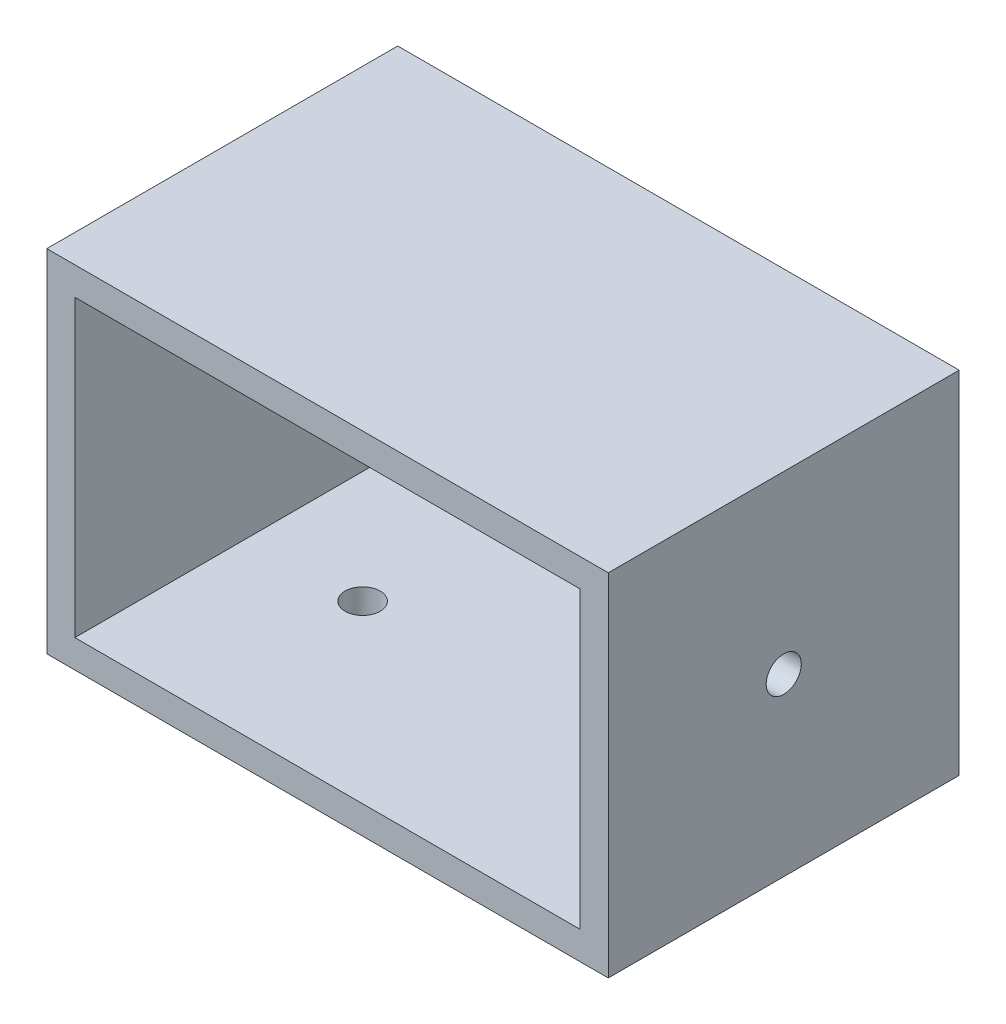
ISO-10303-21;
HEADER;
FILE_DESCRIPTION(('STEP AP214'),'2;1');
FILE_NAME('part.step','',(''),(''),'','','');
FILE_SCHEMA(('AUTOMOTIVE_DESIGN { 1 0 10303 214 1 1 1 1 }'));
ENDSEC;
DATA;
#1=APPLICATION_CONTEXT('core data for automotive mechanical design processes');
#2=APPLICATION_PROTOCOL_DEFINITION('international standard','automotive_design',2000,#1);
#3=PRODUCT_CONTEXT('',#1,'mechanical');
#4=PRODUCT('Part','Part','',(#3));
#5=PRODUCT_RELATED_PRODUCT_CATEGORY('part','',(#4));
#6=PRODUCT_DEFINITION_FORMATION('','',#4);
#7=PRODUCT_DEFINITION_CONTEXT('part definition',#1,'design');
#8=PRODUCT_DEFINITION('design','',#6,#7);
#9=PRODUCT_DEFINITION_SHAPE('','',#8);
#10=(LENGTH_UNIT() NAMED_UNIT(*) SI_UNIT(.MILLI.,.METRE.));
#11=(NAMED_UNIT(*) PLANE_ANGLE_UNIT() SI_UNIT($,.RADIAN.));
#12=(NAMED_UNIT(*) SI_UNIT($,.STERADIAN.) SOLID_ANGLE_UNIT());
#13=UNCERTAINTY_MEASURE_WITH_UNIT(LENGTH_MEASURE(1.E-05),#10,'distance_accuracy_value','');
#14=(GEOMETRIC_REPRESENTATION_CONTEXT(3) GLOBAL_UNCERTAINTY_ASSIGNED_CONTEXT((#13)) GLOBAL_UNIT_ASSIGNED_CONTEXT((#10,
#11,#12)) REPRESENTATION_CONTEXT('',''));
#15=CARTESIAN_POINT('',(0.,0.,0.));
#16=DIRECTION('',(0.,0.,1.));
#17=DIRECTION('',(1.,0.,0.));
#18=AXIS2_PLACEMENT_3D('',#15,#16,#17);
#19=CARTESIAN_POINT('',(0.,-8.,100.));
#20=DIRECTION('',(0.,1.,0.));
#21=DIRECTION('',(0.,0.,1.));
#22=AXIS2_PLACEMENT_3D('',#19,#20,#21);
#23=PLANE('',#22);
#24=DIRECTION('',(1.,0.,0.));
#25=VECTOR('',#24,1.);
#26=CARTESIAN_POINT('',(0.,-8.,0.));
#27=LINE('',#26,#25);
#28=CARTESIAN_POINT('',(8.,-8.,0.));
#29=VERTEX_POINT('',#28);
#30=CARTESIAN_POINT('',(152.,-8.,0.));
#31=VERTEX_POINT('',#30);
#32=EDGE_CURVE('E143',#29,#31,#27,.T.);
#33=ORIENTED_EDGE('',*,*,#32,.T.);
#34=DIRECTION('',(0.,0.,-1.));
#35=VECTOR('',#34,1.);
#36=CARTESIAN_POINT('',(152.,-8.,100.));
#37=LINE('',#36,#35);
#38=CARTESIAN_POINT('',(152.,-8.,100.));
#39=VERTEX_POINT('',#38);
#40=EDGE_CURVE('E11',#39,#31,#37,.T.);
#41=ORIENTED_EDGE('',*,*,#40,.F.);
#42=DIRECTION('',(1.,0.,0.));
#43=VECTOR('',#42,1.);
#44=CARTESIAN_POINT('',(0.,-8.,100.));
#45=LINE('',#44,#43);
#46=CARTESIAN_POINT('',(8.,-8.,100.));
#47=VERTEX_POINT('',#46);
#48=EDGE_CURVE('E114',#47,#39,#45,.T.);
#49=ORIENTED_EDGE('',*,*,#48,.F.);
#50=DIRECTION('',(0.,0.,-1.));
#51=VECTOR('',#50,1.);
#52=CARTESIAN_POINT('',(8.,-8.,100.));
#53=LINE('',#52,#51);
#54=EDGE_CURVE('E54',#47,#29,#53,.T.);
#55=ORIENTED_EDGE('',*,*,#54,.T.);
#56=EDGE_LOOP('',(#33,#41,#49,#55));
#57=FACE_BOUND('',#56,.T.);
#58=ADVANCED_FACE('F35',(#57),#23,.F.);
#59=CARTESIAN_POINT('',(152.,0.,100.));
#60=DIRECTION('',(1.,0.,0.));
#61=DIRECTION('',(0.,1.,0.));
#62=AXIS2_PLACEMENT_3D('',#59,#60,#61);
#63=PLANE('',#62);
#64=CARTESIAN_POINT('',(152.,-50.,50.));
#65=DIRECTION('',(1.,0.,0.));
#66=DIRECTION('',(0.,1.,0.));
#67=AXIS2_PLACEMENT_3D('',#64,#65,#66);
#68=CIRCLE('',#67,5.);
#69=CARTESIAN_POINT('',(152.,-45.,50.));
#70=VERTEX_POINT('',#69);
#71=EDGE_CURVE('E190',#70,#70,#68,.T.);
#72=ORIENTED_EDGE('',*,*,#71,.T.);
#73=EDGE_LOOP('',(#72));
#74=FACE_BOUND('',#73,.T.);
#75=DIRECTION('',(0.,-1.,0.));
#76=VECTOR('',#75,1.);
#77=CARTESIAN_POINT('',(152.,0.,0.));
#78=LINE('',#77,#76);
#79=CARTESIAN_POINT('',(152.,-92.,0.));
#80=VERTEX_POINT('',#79);
#81=EDGE_CURVE('E120',#31,#80,#78,.T.);
#82=ORIENTED_EDGE('',*,*,#81,.T.);
#83=DIRECTION('',(0.,0.,-1.));
#84=VECTOR('',#83,1.);
#85=CARTESIAN_POINT('',(152.,-92.,100.));
#86=LINE('',#85,#84);
#87=CARTESIAN_POINT('',(152.,-92.,100.));
#88=VERTEX_POINT('',#87);
#89=EDGE_CURVE('E45',#88,#80,#86,.T.);
#90=ORIENTED_EDGE('',*,*,#89,.F.);
#91=DIRECTION('',(0.,-1.,0.));
#92=VECTOR('',#91,1.);
#93=CARTESIAN_POINT('',(152.,0.,100.));
#94=LINE('',#93,#92);
#95=EDGE_CURVE('E108',#39,#88,#94,.T.);
#96=ORIENTED_EDGE('',*,*,#95,.F.);
#97=ORIENTED_EDGE('',*,*,#40,.T.);
#98=EDGE_LOOP('',(#82,#90,#96,#97));
#99=FACE_BOUND('',#98,.T.);
#100=ADVANCED_FACE('F119',(#74,#99),#63,.F.);
#101=CARTESIAN_POINT('',(0.,-92.,100.));
#102=DIRECTION('',(0.,1.,0.));
#103=DIRECTION('',(0.,0.,1.));
#104=AXIS2_PLACEMENT_3D('',#101,#102,#103);
#105=PLANE('',#104);
#106=CARTESIAN_POINT('',(40.,-92.,50.));
#107=DIRECTION('',(0.,1.,0.));
#108=DIRECTION('',(0.,0.,1.));
#109=AXIS2_PLACEMENT_3D('',#106,#107,#108);
#110=CIRCLE('',#109,5.00000000000001);
#111=CARTESIAN_POINT('',(40.,-92.,55.));
#112=VERTEX_POINT('',#111);
#113=EDGE_CURVE('E135',#112,#112,#110,.T.);
#114=ORIENTED_EDGE('',*,*,#113,.F.);
#115=EDGE_LOOP('',(#114));
#116=FACE_BOUND('',#115,.T.);
#117=DIRECTION('',(1.,0.,0.));
#118=VECTOR('',#117,1.);
#119=CARTESIAN_POINT('',(0.,-92.,0.));
#120=LINE('',#119,#118);
#121=CARTESIAN_POINT('',(8.00000000000001,-92.,0.));
#122=VERTEX_POINT('',#121);
#123=EDGE_CURVE('E146',#122,#80,#120,.T.);
#124=ORIENTED_EDGE('',*,*,#123,.F.);
#125=DIRECTION('',(0.,0.,-1.));
#126=VECTOR('',#125,1.);
#127=CARTESIAN_POINT('',(8.00000000000001,-92.,100.));
#128=LINE('',#127,#126);
#129=CARTESIAN_POINT('',(8.00000000000001,-92.,100.));
#130=VERTEX_POINT('',#129);
#131=EDGE_CURVE('E80',#130,#122,#128,.T.);
#132=ORIENTED_EDGE('',*,*,#131,.F.);
#133=DIRECTION('',(1.,0.,0.));
#134=VECTOR('',#133,1.);
#135=CARTESIAN_POINT('',(0.,-92.,100.));
#136=LINE('',#135,#134);
#137=EDGE_CURVE('E113',#130,#88,#136,.T.);
#138=ORIENTED_EDGE('',*,*,#137,.T.);
#139=ORIENTED_EDGE('',*,*,#89,.T.);
#140=EDGE_LOOP('',(#124,#132,#138,#139));
#141=FACE_BOUND('',#140,.T.);
#142=ADVANCED_FACE('F124',(#116,#141),#105,.T.);
#143=CARTESIAN_POINT('',(160.,0.,100.));
#144=DIRECTION('',(1.,0.,0.));
#145=DIRECTION('',(0.,1.,0.));
#146=AXIS2_PLACEMENT_3D('',#143,#144,#145);
#147=PLANE('',#146);
#148=CARTESIAN_POINT('',(160.,-50.,50.));
#149=DIRECTION('',(1.,0.,0.));
#150=DIRECTION('',(0.,1.,0.));
#151=AXIS2_PLACEMENT_3D('',#148,#149,#150);
#152=CIRCLE('',#151,5.);
#153=CARTESIAN_POINT('',(160.,-45.,50.));
#154=VERTEX_POINT('',#153);
#155=EDGE_CURVE('E193',#154,#154,#152,.T.);
#156=ORIENTED_EDGE('',*,*,#155,.F.);
#157=EDGE_LOOP('',(#156));
#158=FACE_BOUND('',#157,.T.);
#159=DIRECTION('',(0.,-1.,0.));
#160=VECTOR('',#159,1.);
#161=CARTESIAN_POINT('',(160.,0.,0.));
#162=LINE('',#161,#160);
#163=CARTESIAN_POINT('',(160.,0.,0.));
#164=VERTEX_POINT('',#163);
#165=CARTESIAN_POINT('',(160.,-100.,0.));
#166=VERTEX_POINT('',#165);
#167=EDGE_CURVE('E131',#164,#166,#162,.T.);
#168=ORIENTED_EDGE('',*,*,#167,.F.);
#169=DIRECTION('',(0.,0.,-1.));
#170=VECTOR('',#169,1.);
#171=CARTESIAN_POINT('',(160.,0.,100.));
#172=LINE('',#171,#170);
#173=CARTESIAN_POINT('',(160.,0.,100.));
#174=VERTEX_POINT('',#173);
#175=EDGE_CURVE('E39',#174,#164,#172,.T.);
#176=ORIENTED_EDGE('',*,*,#175,.F.);
#177=DIRECTION('',(0.,-1.,0.));
#178=VECTOR('',#177,1.);
#179=CARTESIAN_POINT('',(160.,0.,100.));
#180=LINE('',#179,#178);
#181=CARTESIAN_POINT('',(160.,-100.,100.));
#182=VERTEX_POINT('',#181);
#183=EDGE_CURVE('E151',#174,#182,#180,.T.);
#184=ORIENTED_EDGE('',*,*,#183,.T.);
#185=DIRECTION('',(0.,0.,-1.));
#186=VECTOR('',#185,1.);
#187=CARTESIAN_POINT('',(160.,-100.,100.));
#188=LINE('',#187,#186);
#189=EDGE_CURVE('E127',#182,#166,#188,.T.);
#190=ORIENTED_EDGE('',*,*,#189,.T.);
#191=EDGE_LOOP('',(#168,#176,#184,#190));
#192=FACE_BOUND('',#191,.T.);
#193=ADVANCED_FACE('F37',(#158,#192),#147,.T.);
#194=CARTESIAN_POINT('',(0.,0.,100.));
#195=DIRECTION('',(0.,1.,0.));
#196=DIRECTION('',(-1.,0.,0.));
#197=AXIS2_PLACEMENT_3D('',#194,#195,#196);
#198=PLANE('',#197);
#199=DIRECTION('',(1.,0.,0.));
#200=VECTOR('',#199,1.);
#201=CARTESIAN_POINT('',(0.,0.,0.));
#202=LINE('',#201,#200);
#203=CARTESIAN_POINT('',(0.,0.,0.));
#204=VERTEX_POINT('',#203);
#205=EDGE_CURVE('E134',#204,#164,#202,.T.);
#206=ORIENTED_EDGE('',*,*,#205,.F.);
#207=DIRECTION('',(0.,0.,-1.));
#208=VECTOR('',#207,1.);
#209=CARTESIAN_POINT('',(0.,0.,100.));
#210=LINE('',#209,#208);
#211=CARTESIAN_POINT('',(0.,0.,100.));
#212=VERTEX_POINT('',#211);
#213=EDGE_CURVE('E157',#212,#204,#210,.T.);
#214=ORIENTED_EDGE('',*,*,#213,.F.);
#215=DIRECTION('',(1.,0.,0.));
#216=VECTOR('',#215,1.);
#217=CARTESIAN_POINT('',(0.,0.,100.));
#218=LINE('',#217,#216);
#219=EDGE_CURVE('E166',#212,#174,#218,.T.);
#220=ORIENTED_EDGE('',*,*,#219,.T.);
#221=ORIENTED_EDGE('',*,*,#175,.T.);
#222=EDGE_LOOP('',(#206,#214,#220,#221));
#223=FACE_BOUND('',#222,.T.);
#224=ADVANCED_FACE('F164',(#223),#198,.T.);
#225=CARTESIAN_POINT('',(0.,0.,100.));
#226=DIRECTION('',(1.,0.,0.));
#227=DIRECTION('',(0.,1.,0.));
#228=AXIS2_PLACEMENT_3D('',#225,#226,#227);
#229=PLANE('',#228);
#230=DIRECTION('',(0.,-1.,0.));
#231=VECTOR('',#230,1.);
#232=CARTESIAN_POINT('',(0.,0.,0.));
#233=LINE('',#232,#231);
#234=CARTESIAN_POINT('',(0.,-100.,0.));
#235=VERTEX_POINT('',#234);
#236=EDGE_CURVE('E138',#204,#235,#233,.T.);
#237=ORIENTED_EDGE('',*,*,#236,.T.);
#238=DIRECTION('',(0.,0.,-1.));
#239=VECTOR('',#238,1.);
#240=CARTESIAN_POINT('',(0.,-100.,100.));
#241=LINE('',#240,#239);
#242=CARTESIAN_POINT('',(0.,-100.,100.));
#243=VERTEX_POINT('',#242);
#244=EDGE_CURVE('E155',#243,#235,#241,.T.);
#245=ORIENTED_EDGE('',*,*,#244,.F.);
#246=DIRECTION('',(0.,-1.,0.));
#247=VECTOR('',#246,1.);
#248=CARTESIAN_POINT('',(0.,0.,100.));
#249=LINE('',#248,#247);
#250=EDGE_CURVE('E179',#212,#243,#249,.T.);
#251=ORIENTED_EDGE('',*,*,#250,.F.);
#252=ORIENTED_EDGE('',*,*,#213,.T.);
#253=EDGE_LOOP('',(#237,#245,#251,#252));
#254=FACE_BOUND('',#253,.T.);
#255=ADVANCED_FACE('F173',(#254),#229,.F.);
#256=CARTESIAN_POINT('',(0.,-100.,100.));
#257=DIRECTION('',(0.,1.,0.));
#258=DIRECTION('',(-1.,0.,0.));
#259=AXIS2_PLACEMENT_3D('',#256,#257,#258);
#260=PLANE('',#259);
#261=CARTESIAN_POINT('',(40.,-100.,50.));
#262=DIRECTION('',(0.,-1.,0.));
#263=DIRECTION('',(0.,0.,-1.));
#264=AXIS2_PLACEMENT_3D('',#261,#262,#263);
#265=CIRCLE('',#264,5.00000000000001);
#266=CARTESIAN_POINT('',(40.,-100.,45.));
#267=VERTEX_POINT('',#266);
#268=EDGE_CURVE('E187',#267,#267,#265,.T.);
#269=ORIENTED_EDGE('',*,*,#268,.F.);
#270=EDGE_LOOP('',(#269));
#271=FACE_BOUND('',#270,.T.);
#272=DIRECTION('',(1.,0.,0.));
#273=VECTOR('',#272,1.);
#274=CARTESIAN_POINT('',(0.,-100.,0.));
#275=LINE('',#274,#273);
#276=EDGE_CURVE('E140',#235,#166,#275,.T.);
#277=ORIENTED_EDGE('',*,*,#276,.T.);
#278=ORIENTED_EDGE('',*,*,#189,.F.);
#279=DIRECTION('',(1.,0.,0.));
#280=VECTOR('',#279,1.);
#281=CARTESIAN_POINT('',(0.,-100.,100.));
#282=LINE('',#281,#280);
#283=EDGE_CURVE('E177',#243,#182,#282,.T.);
#284=ORIENTED_EDGE('',*,*,#283,.F.);
#285=ORIENTED_EDGE('',*,*,#244,.T.);
#286=EDGE_LOOP('',(#277,#278,#284,#285));
#287=FACE_BOUND('',#286,.T.);
#288=ADVANCED_FACE('F176',(#271,#287),#260,.F.);
#289=CARTESIAN_POINT('',(8.,0.,100.));
#290=DIRECTION('',(1.,0.,0.));
#291=DIRECTION('',(0.,1.,0.));
#292=AXIS2_PLACEMENT_3D('',#289,#290,#291);
#293=PLANE('',#292);
#294=DIRECTION('',(0.,-1.,0.));
#295=VECTOR('',#294,1.);
#296=CARTESIAN_POINT('',(8.,0.,0.));
#297=LINE('',#296,#295);
#298=EDGE_CURVE('E148',#29,#122,#297,.T.);
#299=ORIENTED_EDGE('',*,*,#298,.F.);
#300=ORIENTED_EDGE('',*,*,#54,.F.);
#301=DIRECTION('',(0.,-1.,0.));
#302=VECTOR('',#301,1.);
#303=CARTESIAN_POINT('',(8.,0.,100.));
#304=LINE('',#303,#302);
#305=EDGE_CURVE('E125',#47,#130,#304,.T.);
#306=ORIENTED_EDGE('',*,*,#305,.T.);
#307=ORIENTED_EDGE('',*,*,#131,.T.);
#308=EDGE_LOOP('',(#299,#300,#306,#307));
#309=FACE_BOUND('',#308,.T.);
#310=ADVANCED_FACE('F217',(#309),#293,.T.);
#311=CARTESIAN_POINT('',(0.,0.,100.));
#312=DIRECTION('',(0.,0.,1.));
#313=DIRECTION('',(1.,0.,0.));
#314=AXIS2_PLACEMENT_3D('',#311,#312,#313);
#315=PLANE('',#314);
#316=ORIENTED_EDGE('',*,*,#183,.F.);
#317=ORIENTED_EDGE('',*,*,#219,.F.);
#318=ORIENTED_EDGE('',*,*,#250,.T.);
#319=ORIENTED_EDGE('',*,*,#283,.T.);
#320=EDGE_LOOP('',(#316,#317,#318,#319));
#321=FACE_BOUND('',#320,.T.);
#322=ORIENTED_EDGE('',*,*,#48,.T.);
#323=ORIENTED_EDGE('',*,*,#95,.T.);
#324=ORIENTED_EDGE('',*,*,#137,.F.);
#325=ORIENTED_EDGE('',*,*,#305,.F.);
#326=EDGE_LOOP('',(#322,#323,#324,#325));
#327=FACE_BOUND('',#326,.T.);
#328=ADVANCED_FACE('F110',(#321,#327),#315,.T.);
#329=CARTESIAN_POINT('',(0.,0.,0.));
#330=DIRECTION('',(0.,0.,1.));
#331=DIRECTION('',(1.,0.,0.));
#332=AXIS2_PLACEMENT_3D('',#329,#330,#331);
#333=PLANE('',#332);
#334=ORIENTED_EDGE('',*,*,#167,.T.);
#335=ORIENTED_EDGE('',*,*,#276,.F.);
#336=ORIENTED_EDGE('',*,*,#236,.F.);
#337=ORIENTED_EDGE('',*,*,#205,.T.);
#338=EDGE_LOOP('',(#334,#335,#336,#337));
#339=FACE_BOUND('',#338,.T.);
#340=ORIENTED_EDGE('',*,*,#32,.F.);
#341=ORIENTED_EDGE('',*,*,#298,.T.);
#342=ORIENTED_EDGE('',*,*,#123,.T.);
#343=ORIENTED_EDGE('',*,*,#81,.F.);
#344=EDGE_LOOP('',(#340,#341,#342,#343));
#345=FACE_BOUND('',#344,.T.);
#346=ADVANCED_FACE('F170',(#339,#345),#333,.F.);
#347=CARTESIAN_POINT('',(40.,-90.,50.));
#348=DIRECTION('',(0.,-1.,0.));
#349=DIRECTION('',(0.,0.,-1.));
#350=AXIS2_PLACEMENT_3D('',#347,#348,#349);
#351=CYLINDRICAL_SURFACE('',#350,5.00000000000001);
#352=ORIENTED_EDGE('',*,*,#113,.T.);
#353=EDGE_LOOP('',(#352));
#354=FACE_BOUND('',#353,.T.);
#355=ORIENTED_EDGE('',*,*,#268,.T.);
#356=EDGE_LOOP('',(#355));
#357=FACE_BOUND('',#356,.T.);
#358=ADVANCED_FACE('F248',(#354,#357),#351,.F.);
#359=CARTESIAN_POINT('',(150.,-50.,50.));
#360=DIRECTION('',(1.,0.,0.));
#361=DIRECTION('',(0.,1.,0.));
#362=AXIS2_PLACEMENT_3D('',#359,#360,#361);
#363=CYLINDRICAL_SURFACE('',#362,5.);
#364=ORIENTED_EDGE('',*,*,#155,.T.);
#365=EDGE_LOOP('',(#364));
#366=FACE_BOUND('',#365,.T.);
#367=ORIENTED_EDGE('',*,*,#71,.F.);
#368=EDGE_LOOP('',(#367));
#369=FACE_BOUND('',#368,.T.);
#370=ADVANCED_FACE('F197',(#366,#369),#363,.F.);
#371=CLOSED_SHELL('',(#58,#100,#142,#193,#224,#255,#288,#310,#328,#346,#358,#370));
#372=MANIFOLD_SOLID_BREP('B2',#371);
#373=ADVANCED_BREP_SHAPE_REPRESENTATION('',(#18,#372),#14);
#374=SHAPE_DEFINITION_REPRESENTATION(#9,#373);
ENDSEC;
END-ISO-10303-21;
